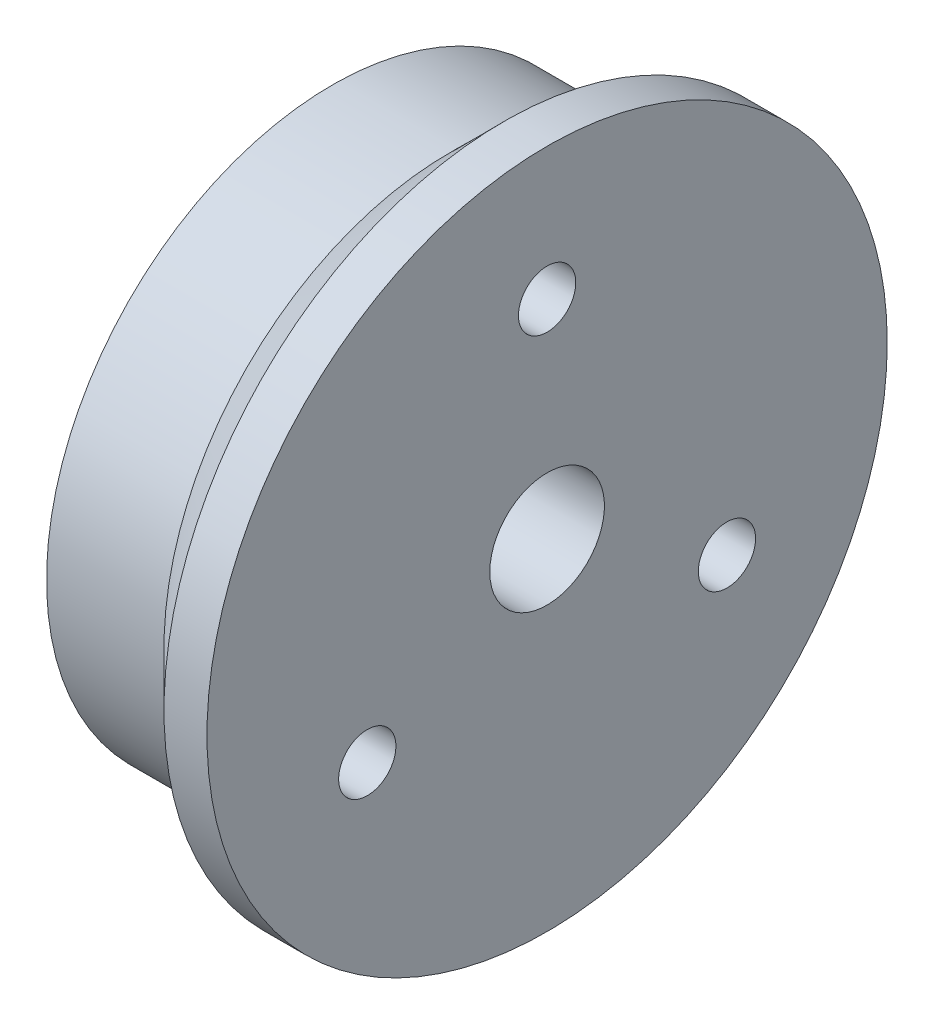
ISO-10303-21;
HEADER;
FILE_DESCRIPTION(('STEP AP214'),'2;1');
FILE_NAME('part.step','',(''),(''),'','','');
FILE_SCHEMA(('AUTOMOTIVE_DESIGN { 1 0 10303 214 1 1 1 1 }'));
ENDSEC;
DATA;
#1=APPLICATION_CONTEXT('core data for automotive mechanical design processes');
#2=APPLICATION_PROTOCOL_DEFINITION('international standard','automotive_design',2000,#1);
#3=PRODUCT_CONTEXT('',#1,'mechanical');
#4=PRODUCT('Part','Part','',(#3));
#5=PRODUCT_RELATED_PRODUCT_CATEGORY('part','',(#4));
#6=PRODUCT_DEFINITION_FORMATION('','',#4);
#7=PRODUCT_DEFINITION_CONTEXT('part definition',#1,'design');
#8=PRODUCT_DEFINITION('design','',#6,#7);
#9=PRODUCT_DEFINITION_SHAPE('','',#8);
#10=(LENGTH_UNIT() NAMED_UNIT(*) SI_UNIT(.MILLI.,.METRE.));
#11=(NAMED_UNIT(*) PLANE_ANGLE_UNIT() SI_UNIT($,.RADIAN.));
#12=(NAMED_UNIT(*) SI_UNIT($,.STERADIAN.) SOLID_ANGLE_UNIT());
#13=UNCERTAINTY_MEASURE_WITH_UNIT(LENGTH_MEASURE(1.E-05),#10,'distance_accuracy_value','');
#14=(GEOMETRIC_REPRESENTATION_CONTEXT(3) GLOBAL_UNCERTAINTY_ASSIGNED_CONTEXT((#13)) GLOBAL_UNIT_ASSIGNED_CONTEXT((#10,
#11,#12)) REPRESENTATION_CONTEXT('',''));
#15=CARTESIAN_POINT('',(0.,0.,0.));
#16=DIRECTION('',(0.,0.,1.));
#17=DIRECTION('',(1.,0.,0.));
#18=AXIS2_PLACEMENT_3D('',#15,#16,#17);
#19=CARTESIAN_POINT('',(6.50000999980921,-249.999999999978,-431.831385650785));
#20=DIRECTION('',(1.,0.,-3.8208128042193E-13));
#21=DIRECTION('',(-3.8208128042193E-13,0.,-1.));
#22=AXIS2_PLACEMENT_3D('',#19,#20,#21);
#23=PLANE('',#22);
#24=CARTESIAN_POINT('',(6.50000999978989,-250.002122473244,-481.831385650792));
#25=DIRECTION('',(-1.,0.,3.8208128042193E-13));
#26=DIRECTION('',(3.8208128042193E-13,0.,1.));
#27=AXIS2_PLACEMENT_3D('',#24,#25,#26);
#28=CIRCLE('',#27,3.99999949999999);
#29=CARTESIAN_POINT('',(6.50000999979142,-250.002122473244,-477.831386150792));
#30=VERTEX_POINT('',#29);
#31=EDGE_CURVE('E66',#30,#30,#28,.T.);
#32=ORIENTED_EDGE('',*,*,#31,.F.);
#33=EDGE_LOOP('',(#32));
#34=FACE_BOUND('',#33,.T.);
#35=CARTESIAN_POINT('',(6.50000999979011,-235.499999999978,-481.831385650785));
#36=DIRECTION('',(-1.,0.,3.8208128042193E-13));
#37=DIRECTION('',(3.8208128042193E-13,0.,1.));
#38=AXIS2_PLACEMENT_3D('',#35,#36,#37);
#39=CIRCLE('',#38,2.);
#40=CARTESIAN_POINT('',(6.50000999979088,-235.499999999978,-479.831385650785));
#41=VERTEX_POINT('',#40);
#42=EDGE_CURVE('E52',#41,#41,#39,.T.);
#43=ORIENTED_EDGE('',*,*,#42,.F.);
#44=EDGE_LOOP('',(#43));
#45=FACE_BOUND('',#44,.T.);
#46=CARTESIAN_POINT('',(6.50000999979489,-257.249999999977,-469.27401729591));
#47=DIRECTION('',(-1.,0.,3.8208128042193E-13));
#48=DIRECTION('',(3.8208128042193E-13,0.,1.));
#49=AXIS2_PLACEMENT_3D('',#46,#47,#48);
#50=CIRCLE('',#49,2.);
#51=CARTESIAN_POINT('',(6.50000999979565,-257.249999999977,-467.27401729591));
#52=VERTEX_POINT('',#51);
#53=EDGE_CURVE('E55',#52,#52,#50,.T.);
#54=ORIENTED_EDGE('',*,*,#53,.F.);
#55=EDGE_LOOP('',(#54));
#56=FACE_BOUND('',#55,.T.);
#57=CARTESIAN_POINT('',(6.50000999978512,-257.249999999978,-494.388754005659));
#58=DIRECTION('',(-1.,0.,3.8208128042193E-13));
#59=DIRECTION('',(3.8208128042193E-13,0.,1.));
#60=AXIS2_PLACEMENT_3D('',#57,#58,#59);
#61=CIRCLE('',#60,2.00000000000001);
#62=CARTESIAN_POINT('',(6.50000999978588,-257.249999999978,-492.388754005659));
#63=VERTEX_POINT('',#62);
#64=EDGE_CURVE('E58',#63,#63,#61,.T.);
#65=ORIENTED_EDGE('',*,*,#64,.F.);
#66=EDGE_LOOP('',(#65));
#67=FACE_BOUND('',#66,.T.);
#68=CARTESIAN_POINT('',(6.50000999979011,-249.999999999978,-481.831385650785));
#69=DIRECTION('',(1.,0.,-3.8208128042193E-13));
#70=DIRECTION('',(-3.8208128042193E-13,0.,-1.));
#71=AXIS2_PLACEMENT_3D('',#68,#69,#70);
#72=CIRCLE('',#71,19.95);
#73=CARTESIAN_POINT('',(6.50000999978249,-249.999999999978,-501.781385650785));
#74=VERTEX_POINT('',#73);
#75=EDGE_CURVE('E10',#74,#74,#72,.T.);
#76=ORIENTED_EDGE('',*,*,#75,.F.);
#77=EDGE_LOOP('',(#76));
#78=FACE_BOUND('',#77,.T.);
#79=ADVANCED_FACE('F33',(#34,#45,#56,#67,#78),#23,.F.);
#80=CARTESIAN_POINT('',(90.8327272493479,-249.999999999978,-481.831385650818));
#81=DIRECTION('',(1.,0.,-3.8208128042193E-13));
#82=DIRECTION('',(-3.8208128042193E-13,0.,-1.));
#83=AXIS2_PLACEMENT_3D('',#80,#81,#82);
#84=CYLINDRICAL_SURFACE('',#83,19.95);
#85=ORIENTED_EDGE('',*,*,#75,.T.);
#86=EDGE_LOOP('',(#85));
#87=FACE_BOUND('',#86,.T.);
#88=CARTESIAN_POINT('',(14.6991478026549,-249.999999999978,-481.831385650788));
#89=DIRECTION('',(1.,0.,-3.8208128042193E-13));
#90=DIRECTION('',(-3.8208128042193E-13,0.,-1.));
#91=AXIS2_PLACEMENT_3D('',#88,#89,#90);
#92=CIRCLE('',#91,19.95);
#93=CARTESIAN_POINT('',(14.6991478026472,-249.999999999978,-501.781385650788));
#94=VERTEX_POINT('',#93);
#95=EDGE_CURVE('E40',#94,#94,#92,.T.);
#96=ORIENTED_EDGE('',*,*,#95,.F.);
#97=EDGE_LOOP('',(#96));
#98=FACE_BOUND('',#97,.T.);
#99=ADVANCED_FACE('F91',(#87,#98),#84,.T.);
#100=CARTESIAN_POINT('',(18.4991478026549,-249.999999999978,-481.83138565079));
#101=DIRECTION('',(1.,0.,-3.8208128042193E-13));
#102=DIRECTION('',(-3.8208128042193E-13,0.,-1.));
#103=AXIS2_PLACEMENT_3D('',#100,#101,#102);
#104=CONICAL_SURFACE('',#103,23.75,0.78539816339745);
#105=ORIENTED_EDGE('',*,*,#95,.T.);
#106=EDGE_LOOP('',(#105));
#107=FACE_BOUND('',#106,.T.);
#108=CARTESIAN_POINT('',(18.4991478026549,-249.999999999978,-481.83138565079));
#109=DIRECTION('',(1.,0.,-3.8208128042193E-13));
#110=DIRECTION('',(-3.8208128042193E-13,0.,-1.));
#111=AXIS2_PLACEMENT_3D('',#108,#109,#110);
#112=CIRCLE('',#111,23.75);
#113=CARTESIAN_POINT('',(18.4991478026458,-249.999999999978,-505.58138565079));
#114=VERTEX_POINT('',#113);
#115=EDGE_CURVE('E44',#114,#114,#112,.T.);
#116=ORIENTED_EDGE('',*,*,#115,.F.);
#117=EDGE_LOOP('',(#116));
#118=FACE_BOUND('',#117,.T.);
#119=ADVANCED_FACE('F96',(#107,#118),#104,.T.);
#120=CARTESIAN_POINT('',(90.8327272493479,-249.999999999978,-481.831385650818));
#121=DIRECTION('',(1.,0.,-3.8208128042193E-13));
#122=DIRECTION('',(-3.8208128042193E-13,0.,-1.));
#123=AXIS2_PLACEMENT_3D('',#120,#121,#122);
#124=CYLINDRICAL_SURFACE('',#123,23.75);
#125=CARTESIAN_POINT('',(21.50000999979,-249.999999999978,-481.831385650791));
#126=DIRECTION('',(1.,0.,-3.8208128042193E-13));
#127=DIRECTION('',(-3.8208128042193E-13,0.,-1.));
#128=AXIS2_PLACEMENT_3D('',#125,#126,#127);
#129=CIRCLE('',#128,23.75);
#130=CARTESIAN_POINT('',(21.5000099997809,-249.999999999978,-505.581385650791));
#131=VERTEX_POINT('',#130);
#132=EDGE_CURVE('E49',#131,#131,#129,.T.);
#133=ORIENTED_EDGE('',*,*,#132,.F.);
#134=EDGE_LOOP('',(#133));
#135=FACE_BOUND('',#134,.T.);
#136=ORIENTED_EDGE('',*,*,#115,.T.);
#137=EDGE_LOOP('',(#136));
#138=FACE_BOUND('',#137,.T.);
#139=ADVANCED_FACE('F115',(#135,#138),#124,.T.);
#140=CARTESIAN_POINT('',(21.5000099998091,-249.999999999978,-431.831385650791));
#141=DIRECTION('',(1.,0.,-3.8208128042193E-13));
#142=DIRECTION('',(-3.8208128042193E-13,0.,-1.));
#143=AXIS2_PLACEMENT_3D('',#140,#141,#142);
#144=PLANE('',#143);
#145=CARTESIAN_POINT('',(21.50000999979,-250.002122473244,-481.831385650781));
#146=DIRECTION('',(-1.,0.,3.8208128042193E-13));
#147=DIRECTION('',(3.8208128042193E-13,0.,1.));
#148=AXIS2_PLACEMENT_3D('',#145,#146,#147);
#149=CIRCLE('',#148,3.99999949999999);
#150=CARTESIAN_POINT('',(21.5000099997915,-250.002122473244,-477.831386150781));
#151=VERTEX_POINT('',#150);
#152=EDGE_CURVE('E36',#151,#151,#149,.T.);
#153=ORIENTED_EDGE('',*,*,#152,.T.);
#154=EDGE_LOOP('',(#153));
#155=FACE_BOUND('',#154,.T.);
#156=CARTESIAN_POINT('',(21.50000999979,-235.499999999978,-481.831385650791));
#157=DIRECTION('',(-1.,0.,3.8208128042193E-13));
#158=DIRECTION('',(3.8208128042193E-13,0.,1.));
#159=AXIS2_PLACEMENT_3D('',#156,#157,#158);
#160=CIRCLE('',#159,2.);
#161=CARTESIAN_POINT('',(21.5000099997908,-235.499999999978,-479.831385650791));
#162=VERTEX_POINT('',#161);
#163=EDGE_CURVE('E61',#162,#162,#160,.T.);
#164=ORIENTED_EDGE('',*,*,#163,.T.);
#165=EDGE_LOOP('',(#164));
#166=FACE_BOUND('',#165,.T.);
#167=CARTESIAN_POINT('',(21.5000099997948,-257.249999999977,-469.274017295916));
#168=DIRECTION('',(-1.,0.,3.8208128042193E-13));
#169=DIRECTION('',(3.8208128042193E-13,0.,1.));
#170=AXIS2_PLACEMENT_3D('',#167,#168,#169);
#171=CIRCLE('',#170,2.);
#172=CARTESIAN_POINT('',(21.5000099997956,-257.249999999977,-467.274017295916));
#173=VERTEX_POINT('',#172);
#174=EDGE_CURVE('E65',#173,#173,#171,.T.);
#175=ORIENTED_EDGE('',*,*,#174,.T.);
#176=EDGE_LOOP('',(#175));
#177=FACE_BOUND('',#176,.T.);
#178=CARTESIAN_POINT('',(21.5000099997852,-257.249999999978,-494.388754005665));
#179=DIRECTION('',(-1.,0.,3.8208128042193E-13));
#180=DIRECTION('',(3.8208128042193E-13,0.,1.));
#181=AXIS2_PLACEMENT_3D('',#178,#179,#180);
#182=CIRCLE('',#181,2.00000000000001);
#183=CARTESIAN_POINT('',(21.500009999786,-257.249999999978,-492.388754005665));
#184=VERTEX_POINT('',#183);
#185=EDGE_CURVE('E62',#184,#184,#182,.T.);
#186=ORIENTED_EDGE('',*,*,#185,.T.);
#187=EDGE_LOOP('',(#186));
#188=FACE_BOUND('',#187,.T.);
#189=ORIENTED_EDGE('',*,*,#132,.T.);
#190=EDGE_LOOP('',(#189));
#191=FACE_BOUND('',#190,.T.);
#192=ADVANCED_FACE('F77',(#155,#166,#177,#188,#191),#144,.T.);
#193=CARTESIAN_POINT('',(-22.4999900002148,-257.249999999978,-494.388754005648));
#194=DIRECTION('',(1.,0.,-3.8208128042193E-13));
#195=DIRECTION('',(3.8208128042193E-13,0.,1.));
#196=AXIS2_PLACEMENT_3D('',#193,#194,#195);
#197=CYLINDRICAL_SURFACE('',#196,2.00000000000001);
#198=ORIENTED_EDGE('',*,*,#185,.F.);
#199=EDGE_LOOP('',(#198));
#200=FACE_BOUND('',#199,.T.);
#201=ORIENTED_EDGE('',*,*,#64,.T.);
#202=EDGE_LOOP('',(#201));
#203=FACE_BOUND('',#202,.T.);
#204=ADVANCED_FACE('F105',(#200,#203),#197,.F.);
#205=CARTESIAN_POINT('',(-22.4999900002053,-257.249999999977,-469.274017295899));
#206=DIRECTION('',(1.,0.,-3.8208128042193E-13));
#207=DIRECTION('',(3.8208128042193E-13,0.,1.));
#208=AXIS2_PLACEMENT_3D('',#205,#206,#207);
#209=CYLINDRICAL_SURFACE('',#208,2.);
#210=ORIENTED_EDGE('',*,*,#174,.F.);
#211=EDGE_LOOP('',(#210));
#212=FACE_BOUND('',#211,.T.);
#213=ORIENTED_EDGE('',*,*,#53,.T.);
#214=EDGE_LOOP('',(#213));
#215=FACE_BOUND('',#214,.T.);
#216=ADVANCED_FACE('F87',(#212,#215),#209,.F.);
#217=CARTESIAN_POINT('',(-22.49999000021,-235.499999999978,-481.831385650774));
#218=DIRECTION('',(1.,0.,-3.8208128042193E-13));
#219=DIRECTION('',(3.8208128042193E-13,0.,1.));
#220=AXIS2_PLACEMENT_3D('',#217,#218,#219);
#221=CYLINDRICAL_SURFACE('',#220,2.);
#222=ORIENTED_EDGE('',*,*,#163,.F.);
#223=EDGE_LOOP('',(#222));
#224=FACE_BOUND('',#223,.T.);
#225=ORIENTED_EDGE('',*,*,#42,.T.);
#226=EDGE_LOOP('',(#225));
#227=FACE_BOUND('',#226,.T.);
#228=ADVANCED_FACE('F82',(#224,#227),#221,.F.);
#229=CARTESIAN_POINT('',(-105.499990000268,-250.002122473244,-481.831385650877));
#230=DIRECTION('',(1.,0.,7.60448240017832E-13));
#231=DIRECTION('',(-7.60448240017832E-13,0.,1.));
#232=AXIS2_PLACEMENT_3D('',#229,#230,#231);
#233=CYLINDRICAL_SURFACE('',#232,3.99999949999999);
#234=ORIENTED_EDGE('',*,*,#152,.F.);
#235=EDGE_LOOP('',(#234));
#236=FACE_BOUND('',#235,.T.);
#237=ORIENTED_EDGE('',*,*,#31,.T.);
#238=EDGE_LOOP('',(#237));
#239=FACE_BOUND('',#238,.T.);
#240=ADVANCED_FACE('F80',(#236,#239),#233,.F.);
#241=CLOSED_SHELL('',(#79,#99,#119,#139,#192,#204,#216,#228,#240));
#242=MANIFOLD_SOLID_BREP('B2',#241);
#243=ADVANCED_BREP_SHAPE_REPRESENTATION('',(#18,#242),#14);
#244=SHAPE_DEFINITION_REPRESENTATION(#9,#243);
ENDSEC;
END-ISO-10303-21;
